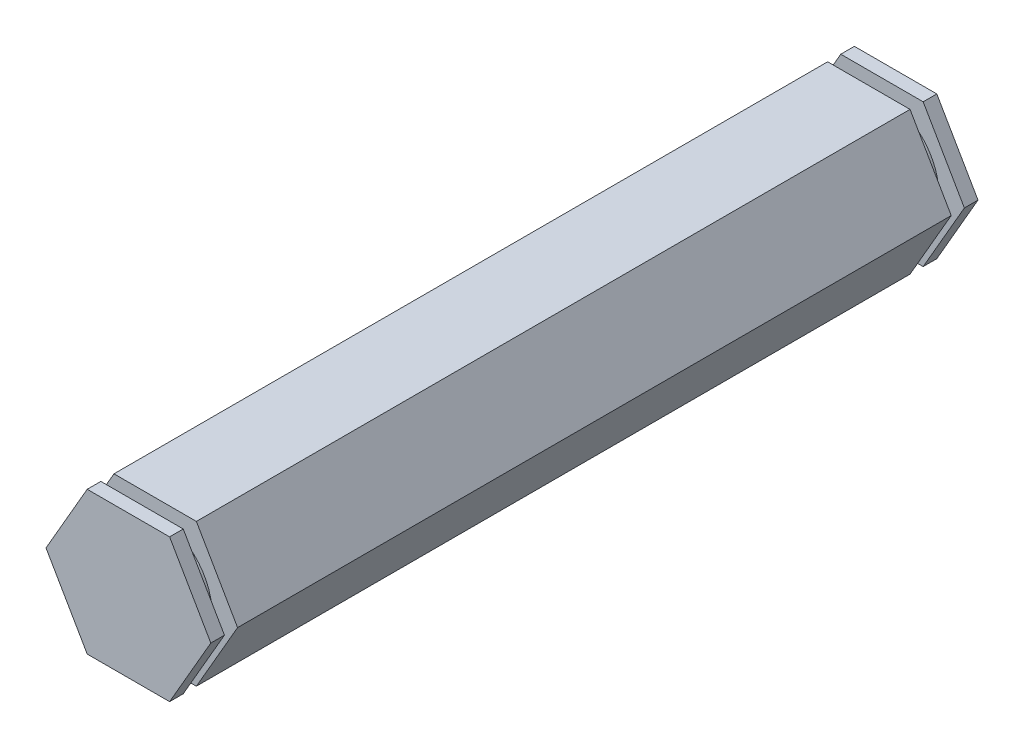
ISO-10303-21;
HEADER;
FILE_DESCRIPTION(('STEP AP214'),'2;1');
FILE_NAME('part.step','',(''),(''),'','','');
FILE_SCHEMA(('AUTOMOTIVE_DESIGN { 1 0 10303 214 1 1 1 1 }'));
ENDSEC;
DATA;
#1=APPLICATION_CONTEXT('core data for automotive mechanical design processes');
#2=APPLICATION_PROTOCOL_DEFINITION('international standard','automotive_design',2000,#1);
#3=PRODUCT_CONTEXT('',#1,'mechanical');
#4=PRODUCT('Part','Part','',(#3));
#5=PRODUCT_RELATED_PRODUCT_CATEGORY('part','',(#4));
#6=PRODUCT_DEFINITION_FORMATION('','',#4);
#7=PRODUCT_DEFINITION_CONTEXT('part definition',#1,'design');
#8=PRODUCT_DEFINITION('design','',#6,#7);
#9=PRODUCT_DEFINITION_SHAPE('','',#8);
#10=(LENGTH_UNIT() NAMED_UNIT(*) SI_UNIT(.MILLI.,.METRE.));
#11=(NAMED_UNIT(*) PLANE_ANGLE_UNIT() SI_UNIT($,.RADIAN.));
#12=(NAMED_UNIT(*) SI_UNIT($,.STERADIAN.) SOLID_ANGLE_UNIT());
#13=UNCERTAINTY_MEASURE_WITH_UNIT(LENGTH_MEASURE(1.E-05),#10,'distance_accuracy_value','');
#14=(GEOMETRIC_REPRESENTATION_CONTEXT(3) GLOBAL_UNCERTAINTY_ASSIGNED_CONTEXT((#13)) GLOBAL_UNIT_ASSIGNED_CONTEXT((#10,
#11,#12)) REPRESENTATION_CONTEXT('',''));
#15=CARTESIAN_POINT('',(0.,0.,0.));
#16=DIRECTION('',(0.,0.,1.));
#17=DIRECTION('',(1.,0.,0.));
#18=AXIS2_PLACEMENT_3D('',#15,#16,#17);
#19=CARTESIAN_POINT('',(3.66617420935412,6.35,34.13125));
#20=DIRECTION('',(0.,-1.,0.));
#21=DIRECTION('',(1.,0.,0.));
#22=AXIS2_PLACEMENT_3D('',#19,#20,#21);
#23=PLANE('',#22);
#24=DIRECTION('',(0.,0.,-1.));
#25=VECTOR('',#24,1.);
#26=CARTESIAN_POINT('',(3.66617420935412,6.35,34.13125));
#27=LINE('',#26,#25);
#28=CARTESIAN_POINT('',(3.66617420935412,6.35,34.13125));
#29=VERTEX_POINT('',#28);
#30=CARTESIAN_POINT('',(3.66617420935412,6.35,32.9184));
#31=VERTEX_POINT('',#30);
#32=EDGE_CURVE('E177',#29,#31,#27,.T.);
#33=ORIENTED_EDGE('',*,*,#32,.T.);
#34=DIRECTION('',(-1.,0.,0.));
#35=VECTOR('',#34,1.);
#36=CARTESIAN_POINT('',(3.66617420935412,6.35,32.9184));
#37=LINE('',#36,#35);
#38=CARTESIAN_POINT('',(-3.66617420935412,6.35,32.9184));
#39=VERTEX_POINT('',#38);
#40=EDGE_CURVE('E224',#31,#39,#37,.T.);
#41=ORIENTED_EDGE('',*,*,#40,.T.);
#42=DIRECTION('',(0.,0.,-1.));
#43=VECTOR('',#42,1.);
#44=CARTESIAN_POINT('',(-3.66617420935412,6.35,34.13125));
#45=LINE('',#44,#43);
#46=CARTESIAN_POINT('',(-3.66617420935412,6.35,34.13125));
#47=VERTEX_POINT('',#46);
#48=EDGE_CURVE('E206',#47,#39,#45,.T.);
#49=ORIENTED_EDGE('',*,*,#48,.F.);
#50=DIRECTION('',(-1.,0.,0.));
#51=VECTOR('',#50,1.);
#52=CARTESIAN_POINT('',(3.66617420935412,6.35,34.13125));
#53=LINE('',#52,#51);
#54=EDGE_CURVE('E226',#29,#47,#53,.T.);
#55=ORIENTED_EDGE('',*,*,#54,.F.);
#56=EDGE_LOOP('',(#33,#41,#49,#55));
#57=FACE_BOUND('',#56,.T.);
#58=ADVANCED_FACE('F34',(#57),#23,.F.);
#59=CARTESIAN_POINT('',(-3.66617420935412,6.35,34.13125));
#60=DIRECTION('',(0.866025403784439,-0.5,0.));
#61=DIRECTION('',(0.5,0.866025403784439,0.));
#62=AXIS2_PLACEMENT_3D('',#59,#60,#61);
#63=PLANE('',#62);
#64=ORIENTED_EDGE('',*,*,#48,.T.);
#65=DIRECTION('',(-0.5,-0.866025403784439,0.));
#66=VECTOR('',#65,1.);
#67=CARTESIAN_POINT('',(-3.66617420935412,6.35,32.9184));
#68=LINE('',#67,#66);
#69=CARTESIAN_POINT('',(-7.33234841870824,0.,32.9184));
#70=VERTEX_POINT('',#69);
#71=EDGE_CURVE('E302',#39,#70,#68,.T.);
#72=ORIENTED_EDGE('',*,*,#71,.T.);
#73=DIRECTION('',(0.,0.,-1.));
#74=VECTOR('',#73,1.);
#75=CARTESIAN_POINT('',(-7.33234841870824,0.,34.13125));
#76=LINE('',#75,#74);
#77=CARTESIAN_POINT('',(-7.33234841870824,0.,34.13125));
#78=VERTEX_POINT('',#77);
#79=EDGE_CURVE('E201',#78,#70,#76,.T.);
#80=ORIENTED_EDGE('',*,*,#79,.F.);
#81=DIRECTION('',(-0.499999999999999,-0.866025403784439,0.));
#82=VECTOR('',#81,1.);
#83=CARTESIAN_POINT('',(-3.66617420935412,6.35,34.13125));
#84=LINE('',#83,#82);
#85=EDGE_CURVE('E228',#47,#78,#84,.T.);
#86=ORIENTED_EDGE('',*,*,#85,.F.);
#87=EDGE_LOOP('',(#64,#72,#80,#86));
#88=FACE_BOUND('',#87,.T.);
#89=ADVANCED_FACE('F306',(#88),#63,.F.);
#90=CARTESIAN_POINT('',(-7.33234841870824,0.,34.13125));
#91=DIRECTION('',(0.866025403784438,0.5,0.));
#92=DIRECTION('',(-0.5,0.866025403784438,0.));
#93=AXIS2_PLACEMENT_3D('',#90,#91,#92);
#94=PLANE('',#93);
#95=ORIENTED_EDGE('',*,*,#79,.T.);
#96=DIRECTION('',(0.5,-0.866025403784438,0.));
#97=VECTOR('',#96,1.);
#98=CARTESIAN_POINT('',(-7.33234841870824,0.,32.9184));
#99=LINE('',#98,#97);
#100=CARTESIAN_POINT('',(-3.66617420935412,-6.35,32.9184));
#101=VERTEX_POINT('',#100);
#102=EDGE_CURVE('E300',#70,#101,#99,.T.);
#103=ORIENTED_EDGE('',*,*,#102,.T.);
#104=DIRECTION('',(0.,0.,-1.));
#105=VECTOR('',#104,1.);
#106=CARTESIAN_POINT('',(-3.66617420935412,-6.35,34.13125));
#107=LINE('',#106,#105);
#108=CARTESIAN_POINT('',(-3.66617420935412,-6.35,34.13125));
#109=VERTEX_POINT('',#108);
#110=EDGE_CURVE('E196',#109,#101,#107,.T.);
#111=ORIENTED_EDGE('',*,*,#110,.F.);
#112=DIRECTION('',(0.5,-0.866025403784438,0.));
#113=VECTOR('',#112,1.);
#114=CARTESIAN_POINT('',(-7.33234841870824,0.,34.13125));
#115=LINE('',#114,#113);
#116=EDGE_CURVE('E230',#78,#109,#115,.T.);
#117=ORIENTED_EDGE('',*,*,#116,.F.);
#118=EDGE_LOOP('',(#95,#103,#111,#117));
#119=FACE_BOUND('',#118,.T.);
#120=ADVANCED_FACE('F309',(#119),#94,.F.);
#121=CARTESIAN_POINT('',(-3.66617420935412,-6.35,34.13125));
#122=DIRECTION('',(0.,1.,0.));
#123=DIRECTION('',(-1.,0.,0.));
#124=AXIS2_PLACEMENT_3D('',#121,#122,#123);
#125=PLANE('',#124);
#126=ORIENTED_EDGE('',*,*,#110,.T.);
#127=DIRECTION('',(1.,0.,0.));
#128=VECTOR('',#127,1.);
#129=CARTESIAN_POINT('',(-3.66617420935412,-6.35,32.9184));
#130=LINE('',#129,#128);
#131=CARTESIAN_POINT('',(3.66617420935413,-6.35,32.9184));
#132=VERTEX_POINT('',#131);
#133=EDGE_CURVE('E297',#101,#132,#130,.T.);
#134=ORIENTED_EDGE('',*,*,#133,.T.);
#135=DIRECTION('',(0.,0.,-1.));
#136=VECTOR('',#135,1.);
#137=CARTESIAN_POINT('',(3.66617420935413,-6.35,34.13125));
#138=LINE('',#137,#136);
#139=CARTESIAN_POINT('',(3.66617420935413,-6.35,34.13125));
#140=VERTEX_POINT('',#139);
#141=EDGE_CURVE('E191',#140,#132,#138,.T.);
#142=ORIENTED_EDGE('',*,*,#141,.F.);
#143=DIRECTION('',(1.,0.,0.));
#144=VECTOR('',#143,1.);
#145=CARTESIAN_POINT('',(-3.66617420935412,-6.35,34.13125));
#146=LINE('',#145,#144);
#147=EDGE_CURVE('E238',#109,#140,#146,.T.);
#148=ORIENTED_EDGE('',*,*,#147,.F.);
#149=EDGE_LOOP('',(#126,#134,#142,#148));
#150=FACE_BOUND('',#149,.T.);
#151=ADVANCED_FACE('F316',(#150),#125,.F.);
#152=CARTESIAN_POINT('',(3.66617420935413,-6.35,34.13125));
#153=DIRECTION('',(-0.866025403784439,0.5,0.));
#154=DIRECTION('',(-0.5,-0.866025403784439,0.));
#155=AXIS2_PLACEMENT_3D('',#152,#153,#154);
#156=PLANE('',#155);
#157=ORIENTED_EDGE('',*,*,#141,.T.);
#158=DIRECTION('',(0.5,0.866025403784439,0.));
#159=VECTOR('',#158,1.);
#160=CARTESIAN_POINT('',(3.66617420935413,-6.35,32.9184));
#161=LINE('',#160,#159);
#162=CARTESIAN_POINT('',(7.33234841870825,0.,32.9184));
#163=VERTEX_POINT('',#162);
#164=EDGE_CURVE('E295',#132,#163,#161,.T.);
#165=ORIENTED_EDGE('',*,*,#164,.T.);
#166=DIRECTION('',(0.,0.,-1.));
#167=VECTOR('',#166,1.);
#168=CARTESIAN_POINT('',(7.33234841870825,0.,34.13125));
#169=LINE('',#168,#167);
#170=CARTESIAN_POINT('',(7.33234841870825,0.,34.13125));
#171=VERTEX_POINT('',#170);
#172=EDGE_CURVE('E187',#171,#163,#169,.T.);
#173=ORIENTED_EDGE('',*,*,#172,.F.);
#174=DIRECTION('',(0.5,0.866025403784439,0.));
#175=VECTOR('',#174,1.);
#176=CARTESIAN_POINT('',(3.66617420935413,-6.35,34.13125));
#177=LINE('',#176,#175);
#178=EDGE_CURVE('E240',#140,#171,#177,.T.);
#179=ORIENTED_EDGE('',*,*,#178,.F.);
#180=EDGE_LOOP('',(#157,#165,#173,#179));
#181=FACE_BOUND('',#180,.T.);
#182=ADVANCED_FACE('F318',(#181),#156,.F.);
#183=CARTESIAN_POINT('',(7.33234841870825,0.,34.13125));
#184=DIRECTION('',(-0.866025403784439,-0.5,0.));
#185=DIRECTION('',(0.5,-0.866025403784439,0.));
#186=AXIS2_PLACEMENT_3D('',#183,#184,#185);
#187=PLANE('',#186);
#188=ORIENTED_EDGE('',*,*,#172,.T.);
#189=DIRECTION('',(-0.5,0.866025403784439,0.));
#190=VECTOR('',#189,1.);
#191=CARTESIAN_POINT('',(7.33234841870825,0.,32.9184));
#192=LINE('',#191,#190);
#193=EDGE_CURVE('E163',#163,#31,#192,.T.);
#194=ORIENTED_EDGE('',*,*,#193,.T.);
#195=ORIENTED_EDGE('',*,*,#32,.F.);
#196=DIRECTION('',(-0.5,0.866025403784438,0.));
#197=VECTOR('',#196,1.);
#198=CARTESIAN_POINT('',(7.33234841870825,0.,34.13125));
#199=LINE('',#198,#197);
#200=EDGE_CURVE('E182',#171,#29,#199,.T.);
#201=ORIENTED_EDGE('',*,*,#200,.F.);
#202=EDGE_LOOP('',(#188,#194,#195,#201));
#203=FACE_BOUND('',#202,.T.);
#204=ADVANCED_FACE('F215',(#203),#187,.F.);
#205=CARTESIAN_POINT('',(0.,0.,34.13125));
#206=DIRECTION('',(0.,0.,1.));
#207=DIRECTION('',(1.,0.,0.));
#208=AXIS2_PLACEMENT_3D('',#205,#206,#207);
#209=PLANE('',#208);
#210=ORIENTED_EDGE('',*,*,#54,.T.);
#211=ORIENTED_EDGE('',*,*,#85,.T.);
#212=ORIENTED_EDGE('',*,*,#116,.T.);
#213=ORIENTED_EDGE('',*,*,#147,.T.);
#214=ORIENTED_EDGE('',*,*,#178,.T.);
#215=ORIENTED_EDGE('',*,*,#200,.T.);
#216=EDGE_LOOP('',(#210,#211,#212,#213,#214,#215));
#217=FACE_BOUND('',#216,.T.);
#218=ADVANCED_FACE('F312',(#217),#209,.T.);
#219=CARTESIAN_POINT('',(0.,5.0546,32.9184));
#220=DIRECTION('',(0.,0.,1.));
#221=DIRECTION('',(0.,-1.,0.));
#222=AXIS2_PLACEMENT_3D('',#219,#220,#221);
#223=PLANE('',#222);
#224=CARTESIAN_POINT('',(0.,0.,32.9184));
#225=DIRECTION('',(0.,0.,-1.));
#226=DIRECTION('',(0.,1.,0.));
#227=AXIS2_PLACEMENT_3D('',#224,#225,#226);
#228=CIRCLE('',#227,5.0546);
#229=CARTESIAN_POINT('',(0.,5.0546,32.9184));
#230=VERTEX_POINT('',#229);
#231=EDGE_CURVE('E270',#230,#230,#228,.T.);
#232=ORIENTED_EDGE('',*,*,#231,.F.);
#233=EDGE_LOOP('',(#232));
#234=FACE_BOUND('',#233,.T.);
#235=ORIENTED_EDGE('',*,*,#193,.F.);
#236=ORIENTED_EDGE('',*,*,#164,.F.);
#237=ORIENTED_EDGE('',*,*,#133,.F.);
#238=ORIENTED_EDGE('',*,*,#102,.F.);
#239=ORIENTED_EDGE('',*,*,#71,.F.);
#240=ORIENTED_EDGE('',*,*,#40,.F.);
#241=EDGE_LOOP('',(#235,#236,#237,#238,#239,#240));
#242=FACE_BOUND('',#241,.T.);
#243=ADVANCED_FACE('F319',(#234,#242),#223,.F.);
#244=CARTESIAN_POINT('',(0.,5.0546,31.75));
#245=DIRECTION('',(0.,0.,-1.));
#246=DIRECTION('',(0.,1.,0.));
#247=AXIS2_PLACEMENT_3D('',#244,#245,#246);
#248=PLANE('',#247);
#249=CARTESIAN_POINT('',(0.,0.,31.75));
#250=DIRECTION('',(0.,0.,-1.));
#251=DIRECTION('',(0.,1.,0.));
#252=AXIS2_PLACEMENT_3D('',#249,#250,#251);
#253=CIRCLE('',#252,5.0546);
#254=CARTESIAN_POINT('',(0.,5.0546,31.75));
#255=VERTEX_POINT('',#254);
#256=EDGE_CURVE('E274',#255,#255,#253,.T.);
#257=ORIENTED_EDGE('',*,*,#256,.T.);
#258=EDGE_LOOP('',(#257));
#259=FACE_BOUND('',#258,.T.);
#260=DIRECTION('',(0.5,0.866025403784439,0.));
#261=VECTOR('',#260,1.);
#262=CARTESIAN_POINT('',(-3.66617420935412,6.35,31.75));
#263=LINE('',#262,#261);
#264=CARTESIAN_POINT('',(-7.33234841870824,0.,31.75));
#265=VERTEX_POINT('',#264);
#266=CARTESIAN_POINT('',(-3.66617420935412,6.35,31.75));
#267=VERTEX_POINT('',#266);
#268=EDGE_CURVE('E291',#265,#267,#263,.T.);
#269=ORIENTED_EDGE('',*,*,#268,.F.);
#270=DIRECTION('',(-0.5,0.866025403784438,0.));
#271=VECTOR('',#270,1.);
#272=CARTESIAN_POINT('',(-7.33234841870824,0.,31.75));
#273=LINE('',#272,#271);
#274=CARTESIAN_POINT('',(-3.66617420935412,-6.35,31.75));
#275=VERTEX_POINT('',#274);
#276=EDGE_CURVE('E288',#275,#265,#273,.T.);
#277=ORIENTED_EDGE('',*,*,#276,.F.);
#278=DIRECTION('',(-1.,0.,0.));
#279=VECTOR('',#278,1.);
#280=CARTESIAN_POINT('',(-3.66617420935412,-6.35,31.75));
#281=LINE('',#280,#279);
#282=CARTESIAN_POINT('',(3.66617420935413,-6.35,31.75));
#283=VERTEX_POINT('',#282);
#284=EDGE_CURVE('E285',#283,#275,#281,.T.);
#285=ORIENTED_EDGE('',*,*,#284,.F.);
#286=DIRECTION('',(-0.5,-0.866025403784439,0.));
#287=VECTOR('',#286,1.);
#288=CARTESIAN_POINT('',(3.66617420935413,-6.35,31.75));
#289=LINE('',#288,#287);
#290=CARTESIAN_POINT('',(7.33234841870825,0.,31.75));
#291=VERTEX_POINT('',#290);
#292=EDGE_CURVE('E282',#291,#283,#289,.T.);
#293=ORIENTED_EDGE('',*,*,#292,.F.);
#294=DIRECTION('',(0.5,-0.866025403784439,0.));
#295=VECTOR('',#294,1.);
#296=CARTESIAN_POINT('',(7.33234841870825,0.,31.75));
#297=LINE('',#296,#295);
#298=CARTESIAN_POINT('',(3.66617420935412,6.35,31.75));
#299=VERTEX_POINT('',#298);
#300=EDGE_CURVE('E209',#299,#291,#297,.T.);
#301=ORIENTED_EDGE('',*,*,#300,.F.);
#302=DIRECTION('',(1.,0.,0.));
#303=VECTOR('',#302,1.);
#304=CARTESIAN_POINT('',(3.66617420935412,6.35,31.75));
#305=LINE('',#304,#303);
#306=EDGE_CURVE('E176',#267,#299,#305,.T.);
#307=ORIENTED_EDGE('',*,*,#306,.F.);
#308=EDGE_LOOP('',(#269,#277,#285,#293,#301,#307));
#309=FACE_BOUND('',#308,.T.);
#310=ADVANCED_FACE('F321',(#259,#309),#248,.F.);
#311=CARTESIAN_POINT('',(0.,0.,0.));
#312=DIRECTION('',(0.,0.,-1.));
#313=DIRECTION('',(0.,1.,0.));
#314=AXIS2_PLACEMENT_3D('',#311,#312,#313);
#315=CYLINDRICAL_SURFACE('',#314,5.0546);
#316=ORIENTED_EDGE('',*,*,#256,.F.);
#317=EDGE_LOOP('',(#316));
#318=FACE_BOUND('',#317,.T.);
#319=ORIENTED_EDGE('',*,*,#231,.T.);
#320=EDGE_LOOP('',(#319));
#321=FACE_BOUND('',#320,.T.);
#322=ADVANCED_FACE('F328',(#318,#321),#315,.T.);
#323=CARTESIAN_POINT('',(7.33234841870825,0.,-31.75));
#324=VERTEX_POINT('',#323);
#325=EDGE_CURVE('E171',#291,#324,#169,.T.);
#326=ORIENTED_EDGE('',*,*,#325,.T.);
#327=DIRECTION('',(-0.5,0.866025403784439,0.));
#328=VECTOR('',#327,1.);
#329=CARTESIAN_POINT('',(7.33234841870825,0.,-31.75));
#330=LINE('',#329,#328);
#331=CARTESIAN_POINT('',(3.66617420935412,6.35,-31.75));
#332=VERTEX_POINT('',#331);
#333=EDGE_CURVE('E157',#324,#332,#330,.T.);
#334=ORIENTED_EDGE('',*,*,#333,.T.);
#335=EDGE_CURVE('E169',#299,#332,#27,.T.);
#336=ORIENTED_EDGE('',*,*,#335,.F.);
#337=ORIENTED_EDGE('',*,*,#300,.T.);
#338=EDGE_LOOP('',(#326,#334,#336,#337));
#339=FACE_BOUND('',#338,.T.);
#340=ADVANCED_FACE('F167',(#339),#187,.F.);
#341=CARTESIAN_POINT('',(3.66617420935413,-6.35,-31.75));
#342=VERTEX_POINT('',#341);
#343=EDGE_CURVE('E195',#283,#342,#138,.T.);
#344=ORIENTED_EDGE('',*,*,#343,.T.);
#345=DIRECTION('',(0.5,0.866025403784439,0.));
#346=VECTOR('',#345,1.);
#347=CARTESIAN_POINT('',(3.66617420935412,-6.35000000000001,-31.75));
#348=LINE('',#347,#346);
#349=EDGE_CURVE('E173',#342,#324,#348,.T.);
#350=ORIENTED_EDGE('',*,*,#349,.T.);
#351=ORIENTED_EDGE('',*,*,#325,.F.);
#352=ORIENTED_EDGE('',*,*,#292,.T.);
#353=EDGE_LOOP('',(#344,#350,#351,#352));
#354=FACE_BOUND('',#353,.T.);
#355=ADVANCED_FACE('F407',(#354),#156,.F.);
#356=CARTESIAN_POINT('',(-3.66617420935412,-6.35,-31.75));
#357=VERTEX_POINT('',#356);
#358=EDGE_CURVE('E200',#275,#357,#107,.T.);
#359=ORIENTED_EDGE('',*,*,#358,.T.);
#360=DIRECTION('',(1.,0.,0.));
#361=VECTOR('',#360,1.);
#362=CARTESIAN_POINT('',(-3.66617420935412,-6.35,-31.75));
#363=LINE('',#362,#361);
#364=EDGE_CURVE('E379',#357,#342,#363,.T.);
#365=ORIENTED_EDGE('',*,*,#364,.T.);
#366=ORIENTED_EDGE('',*,*,#343,.F.);
#367=ORIENTED_EDGE('',*,*,#284,.T.);
#368=EDGE_LOOP('',(#359,#365,#366,#367));
#369=FACE_BOUND('',#368,.T.);
#370=ADVANCED_FACE('F414',(#369),#125,.F.);
#371=CARTESIAN_POINT('',(-7.33234841870824,0.,-31.75));
#372=VERTEX_POINT('',#371);
#373=EDGE_CURVE('E205',#265,#372,#76,.T.);
#374=ORIENTED_EDGE('',*,*,#373,.T.);
#375=DIRECTION('',(0.5,-0.866025403784438,0.));
#376=VECTOR('',#375,1.);
#377=CARTESIAN_POINT('',(-7.33234841870824,0.,-31.75));
#378=LINE('',#377,#376);
#379=EDGE_CURVE('E363',#372,#357,#378,.T.);
#380=ORIENTED_EDGE('',*,*,#379,.T.);
#381=ORIENTED_EDGE('',*,*,#358,.F.);
#382=ORIENTED_EDGE('',*,*,#276,.T.);
#383=EDGE_LOOP('',(#374,#380,#381,#382));
#384=FACE_BOUND('',#383,.T.);
#385=ADVANCED_FACE('F360',(#384),#94,.F.);
#386=CARTESIAN_POINT('',(-3.66617420935412,6.35,-31.75));
#387=VERTEX_POINT('',#386);
#388=EDGE_CURVE('E210',#267,#387,#45,.T.);
#389=ORIENTED_EDGE('',*,*,#388,.T.);
#390=DIRECTION('',(-0.5,-0.866025403784439,0.));
#391=VECTOR('',#390,1.);
#392=CARTESIAN_POINT('',(-3.66617420935413,6.34999999999999,-31.75));
#393=LINE('',#392,#391);
#394=EDGE_CURVE('E56',#387,#372,#393,.T.);
#395=ORIENTED_EDGE('',*,*,#394,.T.);
#396=ORIENTED_EDGE('',*,*,#373,.F.);
#397=ORIENTED_EDGE('',*,*,#268,.T.);
#398=EDGE_LOOP('',(#389,#395,#396,#397));
#399=FACE_BOUND('',#398,.T.);
#400=ADVANCED_FACE('F338',(#399),#63,.F.);
#401=ORIENTED_EDGE('',*,*,#335,.T.);
#402=DIRECTION('',(-1.,0.,0.));
#403=VECTOR('',#402,1.);
#404=CARTESIAN_POINT('',(3.66617420935412,6.35,-31.75));
#405=LINE('',#404,#403);
#406=EDGE_CURVE('E42',#332,#387,#405,.T.);
#407=ORIENTED_EDGE('',*,*,#406,.T.);
#408=ORIENTED_EDGE('',*,*,#388,.F.);
#409=ORIENTED_EDGE('',*,*,#306,.T.);
#410=EDGE_LOOP('',(#401,#407,#408,#409));
#411=FACE_BOUND('',#410,.T.);
#412=ADVANCED_FACE('F36',(#411),#23,.F.);
#413=CARTESIAN_POINT('',(0.,5.0546,-32.9184));
#414=DIRECTION('',(0.,0.,-1.));
#415=DIRECTION('',(0.,-1.,0.));
#416=AXIS2_PLACEMENT_3D('',#413,#414,#415);
#417=PLANE('',#416);
#418=CARTESIAN_POINT('',(0.,0.,-32.9184));
#419=DIRECTION('',(0.,0.,-1.));
#420=DIRECTION('',(0.,1.,0.));
#421=AXIS2_PLACEMENT_3D('',#418,#419,#420);
#422=CIRCLE('',#421,5.0546);
#423=CARTESIAN_POINT('',(0.,5.0546,-32.9184));
#424=VERTEX_POINT('',#423);
#425=EDGE_CURVE('E386',#424,#424,#422,.T.);
#426=ORIENTED_EDGE('',*,*,#425,.T.);
#427=EDGE_LOOP('',(#426));
#428=FACE_BOUND('',#427,.T.);
#429=DIRECTION('',(1.,0.,0.));
#430=VECTOR('',#429,1.);
#431=CARTESIAN_POINT('',(3.66617420935412,6.35,-32.9184));
#432=LINE('',#431,#430);
#433=CARTESIAN_POINT('',(-3.66617420935412,6.35,-32.9184));
#434=VERTEX_POINT('',#433);
#435=CARTESIAN_POINT('',(3.66617420935412,6.35,-32.9184));
#436=VERTEX_POINT('',#435);
#437=EDGE_CURVE('E11',#434,#436,#432,.T.);
#438=ORIENTED_EDGE('',*,*,#437,.F.);
#439=DIRECTION('',(0.5,0.866025403784439,0.));
#440=VECTOR('',#439,1.);
#441=CARTESIAN_POINT('',(-3.66617420935413,6.34999999999999,-32.9184));
#442=LINE('',#441,#440);
#443=CARTESIAN_POINT('',(-7.33234841870824,0.,-32.9184));
#444=VERTEX_POINT('',#443);
#445=EDGE_CURVE('E172',#444,#434,#442,.T.);
#446=ORIENTED_EDGE('',*,*,#445,.F.);
#447=DIRECTION('',(-0.5,0.866025403784438,0.));
#448=VECTOR('',#447,1.);
#449=CARTESIAN_POINT('',(-7.33234841870824,0.,-32.9184));
#450=LINE('',#449,#448);
#451=CARTESIAN_POINT('',(-3.66617420935412,-6.35,-32.9184));
#452=VERTEX_POINT('',#451);
#453=EDGE_CURVE('E374',#452,#444,#450,.T.);
#454=ORIENTED_EDGE('',*,*,#453,.F.);
#455=DIRECTION('',(-1.,0.,0.));
#456=VECTOR('',#455,1.);
#457=CARTESIAN_POINT('',(-3.66617420935412,-6.35,-32.9184));
#458=LINE('',#457,#456);
#459=CARTESIAN_POINT('',(3.66617420935413,-6.35,-32.9184));
#460=VERTEX_POINT('',#459);
#461=EDGE_CURVE('E276',#460,#452,#458,.T.);
#462=ORIENTED_EDGE('',*,*,#461,.F.);
#463=DIRECTION('',(-0.5,-0.866025403784439,0.));
#464=VECTOR('',#463,1.);
#465=CARTESIAN_POINT('',(3.66617420935412,-6.35000000000001,-32.9184));
#466=LINE('',#465,#464);
#467=CARTESIAN_POINT('',(7.33234841870825,0.,-32.9184));
#468=VERTEX_POINT('',#467);
#469=EDGE_CURVE('E271',#468,#460,#466,.T.);
#470=ORIENTED_EDGE('',*,*,#469,.F.);
#471=DIRECTION('',(0.5,-0.866025403784439,0.));
#472=VECTOR('',#471,1.);
#473=CARTESIAN_POINT('',(7.33234841870825,0.,-32.9184));
#474=LINE('',#473,#472);
#475=EDGE_CURVE('E49',#436,#468,#474,.T.);
#476=ORIENTED_EDGE('',*,*,#475,.F.);
#477=EDGE_LOOP('',(#438,#446,#454,#462,#470,#476));
#478=FACE_BOUND('',#477,.T.);
#479=ADVANCED_FACE('F341',(#428,#478),#417,.F.);
#480=CARTESIAN_POINT('',(0.,5.0546,-31.75));
#481=DIRECTION('',(0.,0.,1.));
#482=DIRECTION('',(0.,1.,0.));
#483=AXIS2_PLACEMENT_3D('',#480,#481,#482);
#484=PLANE('',#483);
#485=CARTESIAN_POINT('',(0.,0.,-31.75));
#486=DIRECTION('',(0.,0.,-1.));
#487=DIRECTION('',(0.,1.,0.));
#488=AXIS2_PLACEMENT_3D('',#485,#486,#487);
#489=CIRCLE('',#488,5.0546);
#490=CARTESIAN_POINT('',(0.,5.0546,-31.75));
#491=VERTEX_POINT('',#490);
#492=EDGE_CURVE('E383',#491,#491,#489,.T.);
#493=ORIENTED_EDGE('',*,*,#492,.F.);
#494=EDGE_LOOP('',(#493));
#495=FACE_BOUND('',#494,.T.);
#496=ORIENTED_EDGE('',*,*,#349,.F.);
#497=ORIENTED_EDGE('',*,*,#364,.F.);
#498=ORIENTED_EDGE('',*,*,#379,.F.);
#499=ORIENTED_EDGE('',*,*,#394,.F.);
#500=ORIENTED_EDGE('',*,*,#406,.F.);
#501=ORIENTED_EDGE('',*,*,#333,.F.);
#502=EDGE_LOOP('',(#496,#497,#498,#499,#500,#501));
#503=FACE_BOUND('',#502,.T.);
#504=ADVANCED_FACE('F156',(#495,#503),#484,.F.);
#505=CARTESIAN_POINT('',(0.,0.,0.));
#506=DIRECTION('',(0.,0.,1.));
#507=DIRECTION('',(0.,1.,0.));
#508=AXIS2_PLACEMENT_3D('',#505,#506,#507);
#509=CYLINDRICAL_SURFACE('',#508,5.0546);
#510=ORIENTED_EDGE('',*,*,#492,.T.);
#511=EDGE_LOOP('',(#510));
#512=FACE_BOUND('',#511,.T.);
#513=ORIENTED_EDGE('',*,*,#425,.F.);
#514=EDGE_LOOP('',(#513));
#515=FACE_BOUND('',#514,.T.);
#516=ADVANCED_FACE('F350',(#512,#515),#509,.T.);
#517=CARTESIAN_POINT('',(0.,0.,-34.13125));
#518=DIRECTION('',(0.,0.,1.));
#519=DIRECTION('',(1.,0.,0.));
#520=AXIS2_PLACEMENT_3D('',#517,#518,#519);
#521=PLANE('',#520);
#522=DIRECTION('',(-1.,0.,0.));
#523=VECTOR('',#522,1.);
#524=CARTESIAN_POINT('',(3.66617420935412,6.35,-34.13125));
#525=LINE('',#524,#523);
#526=CARTESIAN_POINT('',(3.66617420935412,6.35,-34.13125));
#527=VERTEX_POINT('',#526);
#528=CARTESIAN_POINT('',(-3.66617420935412,6.35,-34.13125));
#529=VERTEX_POINT('',#528);
#530=EDGE_CURVE('E243',#527,#529,#525,.T.);
#531=ORIENTED_EDGE('',*,*,#530,.F.);
#532=DIRECTION('',(-0.5,0.866025403784438,0.));
#533=VECTOR('',#532,1.);
#534=CARTESIAN_POINT('',(7.33234841870825,0.,-34.13125));
#535=LINE('',#534,#533);
#536=CARTESIAN_POINT('',(7.33234841870825,0.,-34.13125));
#537=VERTEX_POINT('',#536);
#538=EDGE_CURVE('E185',#537,#527,#535,.T.);
#539=ORIENTED_EDGE('',*,*,#538,.F.);
#540=DIRECTION('',(0.5,0.866025403784439,0.));
#541=VECTOR('',#540,1.);
#542=CARTESIAN_POINT('',(3.66617420935413,-6.35,-34.13125));
#543=LINE('',#542,#541);
#544=CARTESIAN_POINT('',(3.66617420935413,-6.35,-34.13125));
#545=VERTEX_POINT('',#544);
#546=EDGE_CURVE('E233',#545,#537,#543,.T.);
#547=ORIENTED_EDGE('',*,*,#546,.F.);
#548=DIRECTION('',(1.,0.,0.));
#549=VECTOR('',#548,1.);
#550=CARTESIAN_POINT('',(-3.66617420935412,-6.35,-34.13125));
#551=LINE('',#550,#549);
#552=CARTESIAN_POINT('',(-3.66617420935412,-6.35,-34.13125));
#553=VERTEX_POINT('',#552);
#554=EDGE_CURVE('E252',#553,#545,#551,.T.);
#555=ORIENTED_EDGE('',*,*,#554,.F.);
#556=DIRECTION('',(0.5,-0.866025403784438,0.));
#557=VECTOR('',#556,1.);
#558=CARTESIAN_POINT('',(-7.33234841870824,0.,-34.13125));
#559=LINE('',#558,#557);
#560=CARTESIAN_POINT('',(-7.33234841870824,0.,-34.13125));
#561=VERTEX_POINT('',#560);
#562=EDGE_CURVE('E249',#561,#553,#559,.T.);
#563=ORIENTED_EDGE('',*,*,#562,.F.);
#564=DIRECTION('',(-0.499999999999999,-0.866025403784439,0.));
#565=VECTOR('',#564,1.);
#566=CARTESIAN_POINT('',(-3.66617420935412,6.35,-34.13125));
#567=LINE('',#566,#565);
#568=EDGE_CURVE('E246',#529,#561,#567,.T.);
#569=ORIENTED_EDGE('',*,*,#568,.F.);
#570=EDGE_LOOP('',(#531,#539,#547,#555,#563,#569));
#571=FACE_BOUND('',#570,.T.);
#572=ADVANCED_FACE('F265',(#571),#521,.F.);
#573=EDGE_CURVE('E204',#434,#529,#45,.T.);
#574=ORIENTED_EDGE('',*,*,#573,.F.);
#575=ORIENTED_EDGE('',*,*,#437,.T.);
#576=EDGE_CURVE('E178',#436,#527,#27,.T.);
#577=ORIENTED_EDGE('',*,*,#576,.T.);
#578=ORIENTED_EDGE('',*,*,#530,.T.);
#579=EDGE_LOOP('',(#574,#575,#577,#578));
#580=FACE_BOUND('',#579,.T.);
#581=ADVANCED_FACE('F334',(#580),#23,.F.);
#582=EDGE_CURVE('E199',#444,#561,#76,.T.);
#583=ORIENTED_EDGE('',*,*,#582,.F.);
#584=ORIENTED_EDGE('',*,*,#445,.T.);
#585=ORIENTED_EDGE('',*,*,#573,.T.);
#586=ORIENTED_EDGE('',*,*,#568,.T.);
#587=EDGE_LOOP('',(#583,#584,#585,#586));
#588=FACE_BOUND('',#587,.T.);
#589=ADVANCED_FACE('F339',(#588),#63,.F.);
#590=EDGE_CURVE('E194',#452,#553,#107,.T.);
#591=ORIENTED_EDGE('',*,*,#590,.F.);
#592=ORIENTED_EDGE('',*,*,#453,.T.);
#593=ORIENTED_EDGE('',*,*,#582,.T.);
#594=ORIENTED_EDGE('',*,*,#562,.T.);
#595=EDGE_LOOP('',(#591,#592,#593,#594));
#596=FACE_BOUND('',#595,.T.);
#597=ADVANCED_FACE('F348',(#596),#94,.F.);
#598=EDGE_CURVE('E190',#460,#545,#138,.T.);
#599=ORIENTED_EDGE('',*,*,#598,.F.);
#600=ORIENTED_EDGE('',*,*,#461,.T.);
#601=ORIENTED_EDGE('',*,*,#590,.T.);
#602=ORIENTED_EDGE('',*,*,#554,.T.);
#603=EDGE_LOOP('',(#599,#600,#601,#602));
#604=FACE_BOUND('',#603,.T.);
#605=ADVANCED_FACE('F369',(#604),#125,.F.);
#606=EDGE_CURVE('E181',#468,#537,#169,.T.);
#607=ORIENTED_EDGE('',*,*,#606,.F.);
#608=ORIENTED_EDGE('',*,*,#469,.T.);
#609=ORIENTED_EDGE('',*,*,#598,.T.);
#610=ORIENTED_EDGE('',*,*,#546,.T.);
#611=EDGE_LOOP('',(#607,#608,#609,#610));
#612=FACE_BOUND('',#611,.T.);
#613=ADVANCED_FACE('F259',(#612),#156,.F.);
#614=ORIENTED_EDGE('',*,*,#576,.F.);
#615=ORIENTED_EDGE('',*,*,#475,.T.);
#616=ORIENTED_EDGE('',*,*,#606,.T.);
#617=ORIENTED_EDGE('',*,*,#538,.T.);
#618=EDGE_LOOP('',(#614,#615,#616,#617));
#619=FACE_BOUND('',#618,.T.);
#620=ADVANCED_FACE('F269',(#619),#187,.F.);
#621=CLOSED_SHELL('',(#58,#89,#120,#151,#182,#204,#218,#243,#310,#322,#340,#355,#370,#385,#400,
#412,#479,#504,#516,#572,#581,#589,#597,#605,#613,#620));
#622=MANIFOLD_SOLID_BREP('B2',#621);
#623=ADVANCED_BREP_SHAPE_REPRESENTATION('',(#18,#622),#14);
#624=SHAPE_DEFINITION_REPRESENTATION(#9,#623);
ENDSEC;
END-ISO-10303-21;
